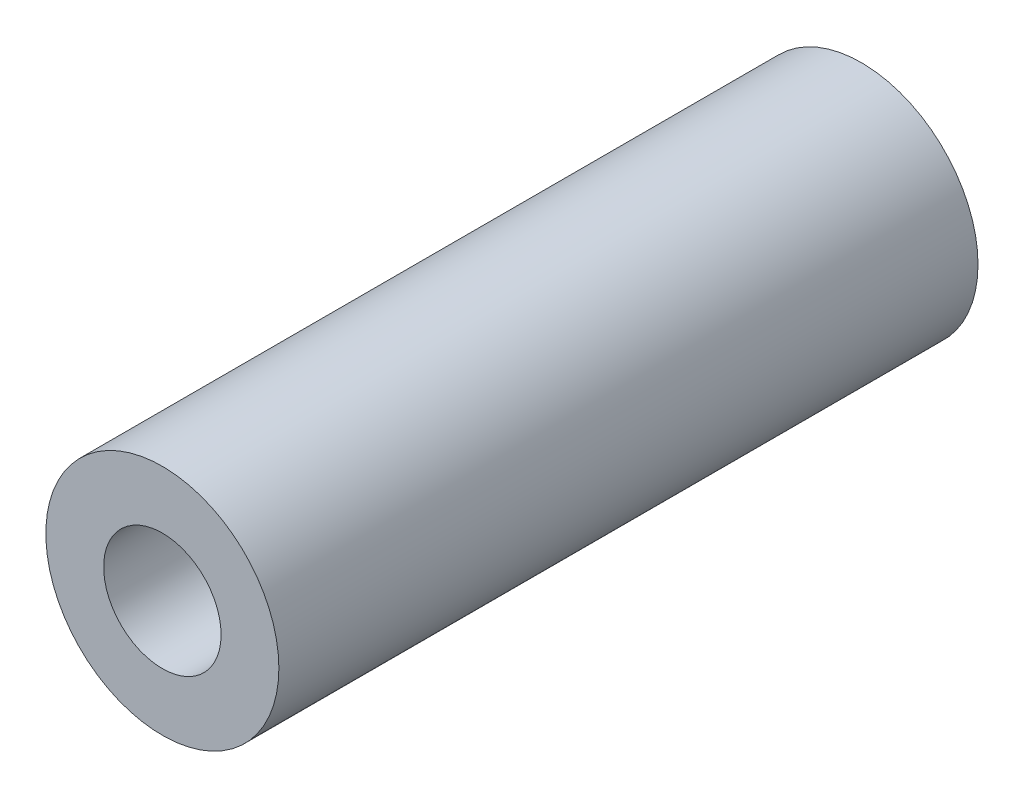
ISO-10303-21;
HEADER;
FILE_DESCRIPTION(('STEP AP214'),'2;1');
FILE_NAME('part.step','',(''),(''),'','','');
FILE_SCHEMA(('AUTOMOTIVE_DESIGN { 1 0 10303 214 1 1 1 1 }'));
ENDSEC;
DATA;
#1=APPLICATION_CONTEXT('core data for automotive mechanical design processes');
#2=APPLICATION_PROTOCOL_DEFINITION('international standard','automotive_design',2000,#1);
#3=PRODUCT_CONTEXT('',#1,'mechanical');
#4=PRODUCT('Part','Part','',(#3));
#5=PRODUCT_RELATED_PRODUCT_CATEGORY('part','',(#4));
#6=PRODUCT_DEFINITION_FORMATION('','',#4);
#7=PRODUCT_DEFINITION_CONTEXT('part definition',#1,'design');
#8=PRODUCT_DEFINITION('design','',#6,#7);
#9=PRODUCT_DEFINITION_SHAPE('','',#8);
#10=(LENGTH_UNIT() NAMED_UNIT(*) SI_UNIT(.MILLI.,.METRE.));
#11=(NAMED_UNIT(*) PLANE_ANGLE_UNIT() SI_UNIT($,.RADIAN.));
#12=(NAMED_UNIT(*) SI_UNIT($,.STERADIAN.) SOLID_ANGLE_UNIT());
#13=UNCERTAINTY_MEASURE_WITH_UNIT(LENGTH_MEASURE(1.E-05),#10,'distance_accuracy_value','');
#14=(GEOMETRIC_REPRESENTATION_CONTEXT(3) GLOBAL_UNCERTAINTY_ASSIGNED_CONTEXT((#13)) GLOBAL_UNIT_ASSIGNED_CONTEXT((#10,
#11,#12)) REPRESENTATION_CONTEXT('',''));
#15=CARTESIAN_POINT('',(0.,0.,0.));
#16=DIRECTION('',(0.,0.,1.));
#17=DIRECTION('',(1.,0.,0.));
#18=AXIS2_PLACEMENT_3D('',#15,#16,#17);
#19=CARTESIAN_POINT('',(0.,0.,-152.4));
#20=DIRECTION('',(0.,0.,1.));
#21=DIRECTION('',(1.,0.,0.));
#22=AXIS2_PLACEMENT_3D('',#19,#20,#21);
#23=CYLINDRICAL_SURFACE('',#22,6.35);
#24=CARTESIAN_POINT('',(0.,0.,-152.4));
#25=DIRECTION('',(0.,0.,1.));
#26=DIRECTION('',(1.,0.,0.));
#27=AXIS2_PLACEMENT_3D('',#24,#25,#26);
#28=CIRCLE('',#27,6.35);
#29=CARTESIAN_POINT('',(6.35,0.,-152.4));
#30=VERTEX_POINT('',#29);
#31=EDGE_CURVE('E10',#30,#30,#28,.T.);
#32=CARTESIAN_POINT('',(0.,0.,-114.3));
#33=DIRECTION('',(0.,0.,1.));
#34=DIRECTION('',(1.,0.,0.));
#35=AXIS2_PLACEMENT_3D('',#32,#33,#34);
#36=CIRCLE('',#35,6.35);
#37=CARTESIAN_POINT('',(6.35,0.,-114.3));
#38=VERTEX_POINT('',#37);
#39=EDGE_CURVE('E43',#38,#38,#36,.F.);
#40=CARTESIAN_POINT('',(6.35,0.,-152.4));
#41=CARTESIAN_POINT('',(6.35,0.,-152.003125));
#42=CARTESIAN_POINT('',(6.35,0.,-151.60625));
#43=CARTESIAN_POINT('',(6.35,0.,-150.8125));
#44=CARTESIAN_POINT('',(6.35,0.,-150.415625));
#45=CARTESIAN_POINT('',(6.35,0.,-149.621875));
#46=CARTESIAN_POINT('',(6.35,0.,-149.225));
#47=CARTESIAN_POINT('',(6.35,0.,-148.43125));
#48=CARTESIAN_POINT('',(6.35,0.,-148.034375));
#49=CARTESIAN_POINT('',(6.35,0.,-147.240625));
#50=CARTESIAN_POINT('',(6.35,0.,-146.84375));
#51=CARTESIAN_POINT('',(6.35,0.,-146.05));
#52=CARTESIAN_POINT('',(6.35,0.,-145.653125));
#53=CARTESIAN_POINT('',(6.35,0.,-144.859375));
#54=CARTESIAN_POINT('',(6.35,0.,-144.4625));
#55=CARTESIAN_POINT('',(6.35,0.,-143.66875));
#56=CARTESIAN_POINT('',(6.35,0.,-143.271875));
#57=CARTESIAN_POINT('',(6.35,0.,-142.478125));
#58=CARTESIAN_POINT('',(6.35,0.,-142.08125));
#59=CARTESIAN_POINT('',(6.35,0.,-141.2875));
#60=CARTESIAN_POINT('',(6.35,0.,-140.890625));
#61=CARTESIAN_POINT('',(6.35,0.,-140.096875));
#62=CARTESIAN_POINT('',(6.35,0.,-139.7));
#63=CARTESIAN_POINT('',(6.35,0.,-138.90625));
#64=CARTESIAN_POINT('',(6.35,0.,-138.509375));
#65=CARTESIAN_POINT('',(6.35,0.,-137.715625));
#66=CARTESIAN_POINT('',(6.35,0.,-137.31875));
#67=CARTESIAN_POINT('',(6.35,0.,-136.525));
#68=CARTESIAN_POINT('',(6.35,0.,-136.128125));
#69=CARTESIAN_POINT('',(6.35,0.,-135.334375));
#70=CARTESIAN_POINT('',(6.35,0.,-134.9375));
#71=CARTESIAN_POINT('',(6.35,0.,-134.14375));
#72=CARTESIAN_POINT('',(6.35,0.,-133.746875));
#73=CARTESIAN_POINT('',(6.35,0.,-132.953125));
#74=CARTESIAN_POINT('',(6.35,0.,-132.55625));
#75=CARTESIAN_POINT('',(6.35,0.,-131.7625));
#76=CARTESIAN_POINT('',(6.35,0.,-131.365625));
#77=CARTESIAN_POINT('',(6.35,0.,-130.571875));
#78=CARTESIAN_POINT('',(6.35,0.,-130.175));
#79=CARTESIAN_POINT('',(6.35,0.,-129.38125));
#80=CARTESIAN_POINT('',(6.35,0.,-128.984375));
#81=CARTESIAN_POINT('',(6.35,0.,-128.190625));
#82=CARTESIAN_POINT('',(6.35,0.,-127.79375));
#83=CARTESIAN_POINT('',(6.35,0.,-127.));
#84=CARTESIAN_POINT('',(6.35,0.,-126.603125));
#85=CARTESIAN_POINT('',(6.35,0.,-125.809375));
#86=CARTESIAN_POINT('',(6.35,0.,-125.4125));
#87=CARTESIAN_POINT('',(6.35,0.,-124.61875));
#88=CARTESIAN_POINT('',(6.35,0.,-124.221875));
#89=CARTESIAN_POINT('',(6.35,0.,-123.428125));
#90=CARTESIAN_POINT('',(6.35,0.,-123.03125));
#91=CARTESIAN_POINT('',(6.35,0.,-122.2375));
#92=CARTESIAN_POINT('',(6.35,0.,-121.840625));
#93=CARTESIAN_POINT('',(6.35,0.,-121.046875));
#94=CARTESIAN_POINT('',(6.35,0.,-120.65));
#95=CARTESIAN_POINT('',(6.35,0.,-119.85625));
#96=CARTESIAN_POINT('',(6.35,0.,-119.459375));
#97=CARTESIAN_POINT('',(6.35,0.,-118.665625));
#98=CARTESIAN_POINT('',(6.35,0.,-118.26875));
#99=CARTESIAN_POINT('',(6.35,0.,-117.475));
#100=CARTESIAN_POINT('',(6.35,0.,-117.078125));
#101=CARTESIAN_POINT('',(6.35,0.,-116.284375));
#102=CARTESIAN_POINT('',(6.35,0.,-115.8875));
#103=CARTESIAN_POINT('',(6.35,0.,-115.09375));
#104=CARTESIAN_POINT('',(6.35,0.,-114.696875));
#105=CARTESIAN_POINT('',(6.35,0.,-114.3));
#106=B_SPLINE_CURVE_WITH_KNOTS('',3,(#40,#41,#42,#43,#44,#45,#46,#47,#48,#49,#50,#51,#52,#53,
#54,#55,#56,#57,#58,#59,#60,#61,#62,#63,#64,#65,#66,#67,#68,#69,#70,#71,#72,#73,#74,#75,#76,#77,
#78,#79,#80,#81,#82,#83,#84,#85,#86,#87,#88,#89,#90,#91,#92,#93,#94,#95,#96,#97,#98,#99,#100,
#101,#102,#103,#104,#105),.UNSPECIFIED.,.F.,.F.,(4,2,2,2,2,2,2,2,2,2,2,2,2,2,2,2,2,2,2,2,2,2,2,
2,2,2,2,2,2,2,2,2,4),(0.,1.190625,2.38125,3.571875,4.7625,5.953125,7.14375,8.334375,
9.52500000000001,10.715625,11.90625,13.096875,14.2875,15.478125,16.66875,17.859375,19.05,
20.240625,21.43125,22.621875,23.8125,25.003125,26.19375,27.384375,28.575,29.765625,30.95625,
32.146875,33.3375,34.528125,35.71875,36.909375,38.1),.UNSPECIFIED.);
#107=EDGE_CURVE('BSEAM32',#30,#38,#106,.T.);
#108=ORIENTED_EDGE('',*,*,#31,.T.);
#109=ORIENTED_EDGE('',*,*,#39,.T.);
#110=ORIENTED_EDGE('',*,*,#107,.T.);
#111=ORIENTED_EDGE('',*,*,#107,.F.);
#112=EDGE_LOOP('',(#108,#110,#109,#111));
#113=FACE_BOUND('',#112,.T.);
#114=ADVANCED_FACE('F32',(#113),#23,.T.);
#115=CARTESIAN_POINT('',(0.,0.,-152.4));
#116=DIRECTION('',(0.,0.,1.));
#117=DIRECTION('',(1.,0.,0.));
#118=AXIS2_PLACEMENT_3D('',#115,#116,#117);
#119=CYLINDRICAL_SURFACE('',#118,3.2004);
#120=CARTESIAN_POINT('',(0.,0.,-152.4));
#121=DIRECTION('',(0.,0.,1.));
#122=DIRECTION('',(1.,0.,0.));
#123=AXIS2_PLACEMENT_3D('',#120,#121,#122);
#124=CIRCLE('',#123,3.2004);
#125=CARTESIAN_POINT('',(3.2004,0.,-152.4));
#126=VERTEX_POINT('',#125);
#127=EDGE_CURVE('E39',#126,#126,#124,.T.);
#128=CARTESIAN_POINT('',(0.,0.,-114.3));
#129=DIRECTION('',(0.,0.,1.));
#130=DIRECTION('',(1.,0.,0.));
#131=AXIS2_PLACEMENT_3D('',#128,#129,#130);
#132=CIRCLE('',#131,3.2004);
#133=CARTESIAN_POINT('',(3.2004,0.,-114.3));
#134=VERTEX_POINT('',#133);
#135=EDGE_CURVE('E35',#134,#134,#132,.F.);
#136=CARTESIAN_POINT('',(3.2004,0.,-152.4));
#137=CARTESIAN_POINT('',(3.2004,0.,-152.003125));
#138=CARTESIAN_POINT('',(3.2004,0.,-151.60625));
#139=CARTESIAN_POINT('',(3.2004,0.,-150.8125));
#140=CARTESIAN_POINT('',(3.2004,0.,-150.415625));
#141=CARTESIAN_POINT('',(3.2004,0.,-149.621875));
#142=CARTESIAN_POINT('',(3.2004,0.,-149.225));
#143=CARTESIAN_POINT('',(3.2004,0.,-148.43125));
#144=CARTESIAN_POINT('',(3.2004,0.,-148.034375));
#145=CARTESIAN_POINT('',(3.2004,0.,-147.240625));
#146=CARTESIAN_POINT('',(3.2004,0.,-146.84375));
#147=CARTESIAN_POINT('',(3.2004,0.,-146.05));
#148=CARTESIAN_POINT('',(3.2004,0.,-145.653125));
#149=CARTESIAN_POINT('',(3.2004,0.,-144.859375));
#150=CARTESIAN_POINT('',(3.2004,0.,-144.4625));
#151=CARTESIAN_POINT('',(3.2004,0.,-143.66875));
#152=CARTESIAN_POINT('',(3.2004,0.,-143.271875));
#153=CARTESIAN_POINT('',(3.2004,0.,-142.478125));
#154=CARTESIAN_POINT('',(3.2004,0.,-142.08125));
#155=CARTESIAN_POINT('',(3.2004,0.,-141.2875));
#156=CARTESIAN_POINT('',(3.2004,0.,-140.890625));
#157=CARTESIAN_POINT('',(3.2004,0.,-140.096875));
#158=CARTESIAN_POINT('',(3.2004,0.,-139.7));
#159=CARTESIAN_POINT('',(3.2004,0.,-138.90625));
#160=CARTESIAN_POINT('',(3.2004,0.,-138.509375));
#161=CARTESIAN_POINT('',(3.2004,0.,-137.715625));
#162=CARTESIAN_POINT('',(3.2004,0.,-137.31875));
#163=CARTESIAN_POINT('',(3.2004,0.,-136.525));
#164=CARTESIAN_POINT('',(3.2004,0.,-136.128125));
#165=CARTESIAN_POINT('',(3.2004,0.,-135.334375));
#166=CARTESIAN_POINT('',(3.2004,0.,-134.9375));
#167=CARTESIAN_POINT('',(3.2004,0.,-134.14375));
#168=CARTESIAN_POINT('',(3.2004,0.,-133.746875));
#169=CARTESIAN_POINT('',(3.2004,0.,-132.953125));
#170=CARTESIAN_POINT('',(3.2004,0.,-132.55625));
#171=CARTESIAN_POINT('',(3.2004,0.,-131.7625));
#172=CARTESIAN_POINT('',(3.2004,0.,-131.365625));
#173=CARTESIAN_POINT('',(3.2004,0.,-130.571875));
#174=CARTESIAN_POINT('',(3.2004,0.,-130.175));
#175=CARTESIAN_POINT('',(3.2004,0.,-129.38125));
#176=CARTESIAN_POINT('',(3.2004,0.,-128.984375));
#177=CARTESIAN_POINT('',(3.2004,0.,-128.190625));
#178=CARTESIAN_POINT('',(3.2004,0.,-127.79375));
#179=CARTESIAN_POINT('',(3.2004,0.,-127.));
#180=CARTESIAN_POINT('',(3.2004,0.,-126.603125));
#181=CARTESIAN_POINT('',(3.2004,0.,-125.809375));
#182=CARTESIAN_POINT('',(3.2004,0.,-125.4125));
#183=CARTESIAN_POINT('',(3.2004,0.,-124.61875));
#184=CARTESIAN_POINT('',(3.2004,0.,-124.221875));
#185=CARTESIAN_POINT('',(3.2004,0.,-123.428125));
#186=CARTESIAN_POINT('',(3.2004,0.,-123.03125));
#187=CARTESIAN_POINT('',(3.2004,0.,-122.2375));
#188=CARTESIAN_POINT('',(3.2004,0.,-121.840625));
#189=CARTESIAN_POINT('',(3.2004,0.,-121.046875));
#190=CARTESIAN_POINT('',(3.2004,0.,-120.65));
#191=CARTESIAN_POINT('',(3.2004,0.,-119.85625));
#192=CARTESIAN_POINT('',(3.2004,0.,-119.459375));
#193=CARTESIAN_POINT('',(3.2004,0.,-118.665625));
#194=CARTESIAN_POINT('',(3.2004,0.,-118.26875));
#195=CARTESIAN_POINT('',(3.2004,0.,-117.475));
#196=CARTESIAN_POINT('',(3.2004,0.,-117.078125));
#197=CARTESIAN_POINT('',(3.2004,0.,-116.284375));
#198=CARTESIAN_POINT('',(3.2004,0.,-115.8875));
#199=CARTESIAN_POINT('',(3.2004,0.,-115.09375));
#200=CARTESIAN_POINT('',(3.2004,0.,-114.696875));
#201=CARTESIAN_POINT('',(3.2004,0.,-114.3));
#202=B_SPLINE_CURVE_WITH_KNOTS('',3,(#136,#137,#138,#139,#140,#141,#142,#143,#144,#145,#146,
#147,#148,#149,#150,#151,#152,#153,#154,#155,#156,#157,#158,#159,#160,#161,#162,#163,#164,#165,
#166,#167,#168,#169,#170,#171,#172,#173,#174,#175,#176,#177,#178,#179,#180,#181,#182,#183,#184,
#185,#186,#187,#188,#189,#190,#191,#192,#193,#194,#195,#196,#197,#198,#199,#200,#201),
.UNSPECIFIED.,.F.,.F.,(4,2,2,2,2,2,2,2,2,2,2,2,2,2,2,2,2,2,2,2,2,2,2,2,2,2,2,2,2,2,2,2,4),(0.,
1.19062500000003,2.38125000000003,3.57187500000003,4.76250000000003,5.95312500000003,
7.14375000000003,8.33437500000003,9.52500000000003,10.715625,11.90625,13.096875,14.2875,
15.478125,16.66875,17.859375,19.05,20.240625,21.43125,22.621875,23.8125,25.003125,26.19375,
27.384375,28.575,29.765625,30.95625,32.146875,33.3375,34.528125,35.71875,36.909375,
38.1000000000001),.UNSPECIFIED.);
#203=EDGE_CURVE('BSEAM54',#126,#134,#202,.T.);
#204=ORIENTED_EDGE('',*,*,#127,.F.);
#205=ORIENTED_EDGE('',*,*,#135,.F.);
#206=ORIENTED_EDGE('',*,*,#203,.T.);
#207=ORIENTED_EDGE('',*,*,#203,.F.);
#208=EDGE_LOOP('',(#204,#206,#205,#207));
#209=FACE_BOUND('',#208,.T.);
#210=ADVANCED_FACE('F54',(#209),#119,.F.);
#211=CARTESIAN_POINT('',(0.,0.,-152.4));
#212=DIRECTION('',(0.,0.,1.));
#213=DIRECTION('',(1.,0.,0.));
#214=AXIS2_PLACEMENT_3D('',#211,#212,#213);
#215=PLANE('',#214);
#216=ORIENTED_EDGE('',*,*,#127,.T.);
#217=EDGE_LOOP('',(#216));
#218=FACE_BOUND('',#217,.T.);
#219=ORIENTED_EDGE('',*,*,#31,.F.);
#220=EDGE_LOOP('',(#219));
#221=FACE_BOUND('',#220,.T.);
#222=ADVANCED_FACE('F56',(#218,#221),#215,.F.);
#223=CARTESIAN_POINT('',(0.,0.,-114.3));
#224=DIRECTION('',(0.,0.,1.));
#225=DIRECTION('',(1.,0.,0.));
#226=AXIS2_PLACEMENT_3D('',#223,#224,#225);
#227=PLANE('',#226);
#228=ORIENTED_EDGE('',*,*,#39,.F.);
#229=EDGE_LOOP('',(#228));
#230=FACE_BOUND('',#229,.T.);
#231=ORIENTED_EDGE('',*,*,#135,.T.);
#232=EDGE_LOOP('',(#231));
#233=FACE_BOUND('',#232,.T.);
#234=ADVANCED_FACE('F52',(#230,#233),#227,.T.);
#235=CLOSED_SHELL('',(#114,#210,#222,#234));
#236=MANIFOLD_SOLID_BREP('B2',#235);
#237=ADVANCED_BREP_SHAPE_REPRESENTATION('',(#18,#236),#14);
#238=SHAPE_DEFINITION_REPRESENTATION(#9,#237);
ENDSEC;
END-ISO-10303-21;
